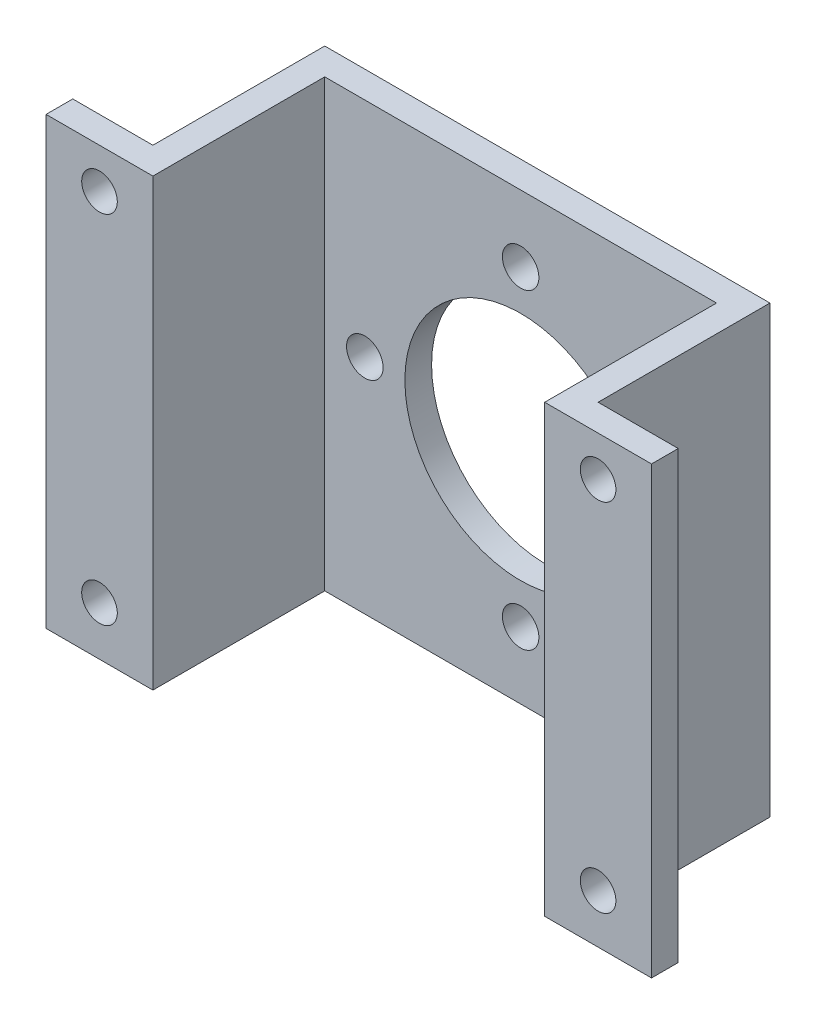
ISO-10303-21;
HEADER;
FILE_DESCRIPTION(('STEP AP214'),'2;1');
FILE_NAME('part.step','',(''),(''),'','','');
FILE_SCHEMA(('AUTOMOTIVE_DESIGN { 1 0 10303 214 1 1 1 1 }'));
ENDSEC;
DATA;
#1=APPLICATION_CONTEXT('core data for automotive mechanical design processes');
#2=APPLICATION_PROTOCOL_DEFINITION('international standard','automotive_design',2000,#1);
#3=PRODUCT_CONTEXT('',#1,'mechanical');
#4=PRODUCT('Part','Part','',(#3));
#5=PRODUCT_RELATED_PRODUCT_CATEGORY('part','',(#4));
#6=PRODUCT_DEFINITION_FORMATION('','',#4);
#7=PRODUCT_DEFINITION_CONTEXT('part definition',#1,'design');
#8=PRODUCT_DEFINITION('design','',#6,#7);
#9=PRODUCT_DEFINITION_SHAPE('','',#8);
#10=(LENGTH_UNIT() NAMED_UNIT(*) SI_UNIT(.MILLI.,.METRE.));
#11=(NAMED_UNIT(*) PLANE_ANGLE_UNIT() SI_UNIT($,.RADIAN.));
#12=(NAMED_UNIT(*) SI_UNIT($,.STERADIAN.) SOLID_ANGLE_UNIT());
#13=UNCERTAINTY_MEASURE_WITH_UNIT(LENGTH_MEASURE(1.E-05),#10,'distance_accuracy_value','');
#14=(GEOMETRIC_REPRESENTATION_CONTEXT(3) GLOBAL_UNCERTAINTY_ASSIGNED_CONTEXT((#13)) GLOBAL_UNIT_ASSIGNED_CONTEXT((#10,
#11,#12)) REPRESENTATION_CONTEXT('',''));
#15=CARTESIAN_POINT('',(0.,0.,0.));
#16=DIRECTION('',(0.,0.,1.));
#17=DIRECTION('',(1.,0.,0.));
#18=AXIS2_PLACEMENT_3D('',#15,#16,#17);
#19=CARTESIAN_POINT('',(-34.,25.,19.3));
#20=DIRECTION('',(0.,0.,-1.));
#21=DIRECTION('',(-1.,0.,0.));
#22=AXIS2_PLACEMENT_3D('',#19,#20,#21);
#23=PLANE('',#22);
#24=CARTESIAN_POINT('',(-28.0000000000001,-19.5,19.3));
#25=DIRECTION('',(0.,0.,-1.));
#26=DIRECTION('',(-1.,0.,0.));
#27=AXIS2_PLACEMENT_3D('',#24,#25,#26);
#28=CIRCLE('',#27,2.00000000000001);
#29=CARTESIAN_POINT('',(-30.0000000000001,-19.5,19.3));
#30=VERTEX_POINT('',#29);
#31=EDGE_CURVE('E302',#30,#30,#28,.T.);
#32=ORIENTED_EDGE('',*,*,#31,.T.);
#33=EDGE_LOOP('',(#32));
#34=FACE_BOUND('',#33,.T.);
#35=CARTESIAN_POINT('',(-28.0000000000001,20.5,19.3));
#36=DIRECTION('',(0.,0.,-1.));
#37=DIRECTION('',(-1.,0.,0.));
#38=AXIS2_PLACEMENT_3D('',#35,#36,#37);
#39=CIRCLE('',#38,2.);
#40=CARTESIAN_POINT('',(-30.0000000000001,20.5,19.3));
#41=VERTEX_POINT('',#40);
#42=EDGE_CURVE('E305',#41,#41,#39,.T.);
#43=ORIENTED_EDGE('',*,*,#42,.T.);
#44=EDGE_LOOP('',(#43));
#45=FACE_BOUND('',#44,.T.);
#46=DIRECTION('',(1.,0.,0.));
#47=VECTOR('',#46,1.);
#48=CARTESIAN_POINT('',(-34.,-25.,19.3));
#49=LINE('',#48,#47);
#50=CARTESIAN_POINT('',(-34.,-25.,19.3));
#51=VERTEX_POINT('',#50);
#52=CARTESIAN_POINT('',(-22.,-25.,19.3));
#53=VERTEX_POINT('',#52);
#54=EDGE_CURVE('E164',#51,#53,#49,.T.);
#55=ORIENTED_EDGE('',*,*,#54,.T.);
#56=DIRECTION('',(0.,-1.,0.));
#57=VECTOR('',#56,1.);
#58=CARTESIAN_POINT('',(-22.,25.,19.3));
#59=LINE('',#58,#57);
#60=CARTESIAN_POINT('',(-22.,25.,19.3));
#61=VERTEX_POINT('',#60);
#62=EDGE_CURVE('E11',#61,#53,#59,.T.);
#63=ORIENTED_EDGE('',*,*,#62,.F.);
#64=DIRECTION('',(1.,0.,0.));
#65=VECTOR('',#64,1.);
#66=CARTESIAN_POINT('',(-34.,25.,19.3));
#67=LINE('',#66,#65);
#68=CARTESIAN_POINT('',(-34.,25.,19.3));
#69=VERTEX_POINT('',#68);
#70=EDGE_CURVE('E199',#69,#61,#67,.T.);
#71=ORIENTED_EDGE('',*,*,#70,.F.);
#72=DIRECTION('',(0.,-1.,0.));
#73=VECTOR('',#72,1.);
#74=CARTESIAN_POINT('',(-34.,25.,19.3));
#75=LINE('',#74,#73);
#76=EDGE_CURVE('E160',#69,#51,#75,.T.);
#77=ORIENTED_EDGE('',*,*,#76,.T.);
#78=EDGE_LOOP('',(#55,#63,#71,#77));
#79=FACE_BOUND('',#78,.T.);
#80=ADVANCED_FACE('F39',(#34,#45,#79),#23,.F.);
#81=CARTESIAN_POINT('',(-22.,25.,19.3));
#82=DIRECTION('',(-1.,0.,0.));
#83=DIRECTION('',(0.,0.,1.));
#84=AXIS2_PLACEMENT_3D('',#81,#82,#83);
#85=PLANE('',#84);
#86=DIRECTION('',(0.,0.,-1.));
#87=VECTOR('',#86,1.);
#88=CARTESIAN_POINT('',(-22.,-25.,19.3));
#89=LINE('',#88,#87);
#90=CARTESIAN_POINT('',(-22.,-25.,0.));
#91=VERTEX_POINT('',#90);
#92=EDGE_CURVE('E168',#53,#91,#89,.T.);
#93=ORIENTED_EDGE('',*,*,#92,.T.);
#94=DIRECTION('',(0.,-1.,0.));
#95=VECTOR('',#94,1.);
#96=CARTESIAN_POINT('',(-22.,25.,0.));
#97=LINE('',#96,#95);
#98=CARTESIAN_POINT('',(-22.,25.,0.));
#99=VERTEX_POINT('',#98);
#100=EDGE_CURVE('E48',#99,#91,#97,.T.);
#101=ORIENTED_EDGE('',*,*,#100,.F.);
#102=DIRECTION('',(0.,0.,-1.));
#103=VECTOR('',#102,1.);
#104=CARTESIAN_POINT('',(-22.,25.,19.3));
#105=LINE('',#104,#103);
#106=EDGE_CURVE('E111',#61,#99,#105,.T.);
#107=ORIENTED_EDGE('',*,*,#106,.F.);
#108=ORIENTED_EDGE('',*,*,#62,.T.);
#109=EDGE_LOOP('',(#93,#101,#107,#108));
#110=FACE_BOUND('',#109,.T.);
#111=ADVANCED_FACE('F294',(#110),#85,.F.);
#112=CARTESIAN_POINT('',(-22.,25.,0.));
#113=DIRECTION('',(0.,0.,-1.));
#114=DIRECTION('',(-1.,0.,0.));
#115=AXIS2_PLACEMENT_3D('',#112,#113,#114);
#116=PLANE('',#115);
#117=CARTESIAN_POINT('',(0.,-17.5,0.));
#118=DIRECTION('',(0.,0.,-1.));
#119=DIRECTION('',(-1.,0.,0.));
#120=AXIS2_PLACEMENT_3D('',#117,#118,#119);
#121=CIRCLE('',#120,2.05);
#122=CARTESIAN_POINT('',(-2.05,-17.5,0.));
#123=VERTEX_POINT('',#122);
#124=EDGE_CURVE('E344',#123,#123,#121,.T.);
#125=ORIENTED_EDGE('',*,*,#124,.T.);
#126=EDGE_LOOP('',(#125));
#127=FACE_BOUND('',#126,.T.);
#128=CARTESIAN_POINT('',(-17.5,0.,0.));
#129=DIRECTION('',(0.,0.,-1.));
#130=DIRECTION('',(-1.,0.,0.));
#131=AXIS2_PLACEMENT_3D('',#128,#129,#130);
#132=CIRCLE('',#131,2.05);
#133=CARTESIAN_POINT('',(-19.55,0.,0.));
#134=VERTEX_POINT('',#133);
#135=EDGE_CURVE('E340',#134,#134,#132,.T.);
#136=ORIENTED_EDGE('',*,*,#135,.T.);
#137=EDGE_LOOP('',(#136));
#138=FACE_BOUND('',#137,.T.);
#139=CARTESIAN_POINT('',(17.5,0.,0.));
#140=DIRECTION('',(0.,0.,-1.));
#141=DIRECTION('',(-1.,0.,0.));
#142=AXIS2_PLACEMENT_3D('',#139,#140,#141);
#143=CIRCLE('',#142,2.05);
#144=CARTESIAN_POINT('',(15.45,0.,0.));
#145=VERTEX_POINT('',#144);
#146=EDGE_CURVE('E336',#145,#145,#143,.T.);
#147=ORIENTED_EDGE('',*,*,#146,.T.);
#148=EDGE_LOOP('',(#147));
#149=FACE_BOUND('',#148,.T.);
#150=CARTESIAN_POINT('',(0.,17.5,0.));
#151=DIRECTION('',(0.,0.,-1.));
#152=DIRECTION('',(-1.,0.,0.));
#153=AXIS2_PLACEMENT_3D('',#150,#151,#152);
#154=CIRCLE('',#153,2.05);
#155=CARTESIAN_POINT('',(-2.05,17.5,0.));
#156=VERTEX_POINT('',#155);
#157=EDGE_CURVE('E329',#156,#156,#154,.T.);
#158=ORIENTED_EDGE('',*,*,#157,.T.);
#159=EDGE_LOOP('',(#158));
#160=FACE_BOUND('',#159,.T.);
#161=CARTESIAN_POINT('',(0.,0.,0.));
#162=DIRECTION('',(0.,0.,-1.));
#163=DIRECTION('',(-1.,0.,0.));
#164=AXIS2_PLACEMENT_3D('',#161,#162,#163);
#165=CIRCLE('',#164,13.);
#166=CARTESIAN_POINT('',(-13.,0.,0.));
#167=VERTEX_POINT('',#166);
#168=EDGE_CURVE('E169',#167,#167,#165,.T.);
#169=ORIENTED_EDGE('',*,*,#168,.T.);
#170=EDGE_LOOP('',(#169));
#171=FACE_BOUND('',#170,.T.);
#172=DIRECTION('',(1.,0.,0.));
#173=VECTOR('',#172,1.);
#174=CARTESIAN_POINT('',(-22.,-25.,0.));
#175=LINE('',#174,#173);
#176=CARTESIAN_POINT('',(22.,-25.,0.));
#177=VERTEX_POINT('',#176);
#178=EDGE_CURVE('E172',#91,#177,#175,.T.);
#179=ORIENTED_EDGE('',*,*,#178,.T.);
#180=DIRECTION('',(0.,-1.,0.));
#181=VECTOR('',#180,1.);
#182=CARTESIAN_POINT('',(22.,25.,0.));
#183=LINE('',#182,#181);
#184=CARTESIAN_POINT('',(22.,25.,0.));
#185=VERTEX_POINT('',#184);
#186=EDGE_CURVE('E226',#185,#177,#183,.T.);
#187=ORIENTED_EDGE('',*,*,#186,.F.);
#188=DIRECTION('',(1.,0.,0.));
#189=VECTOR('',#188,1.);
#190=CARTESIAN_POINT('',(-22.,25.,0.));
#191=LINE('',#190,#189);
#192=EDGE_CURVE('E236',#99,#185,#191,.T.);
#193=ORIENTED_EDGE('',*,*,#192,.F.);
#194=ORIENTED_EDGE('',*,*,#100,.T.);
#195=EDGE_LOOP('',(#179,#187,#193,#194));
#196=FACE_BOUND('',#195,.T.);
#197=ADVANCED_FACE('F234',(#127,#138,#149,#160,#171,#196),#116,.F.);
#198=CARTESIAN_POINT('',(22.,25.,0.));
#199=DIRECTION('',(1.,0.,0.));
#200=DIRECTION('',(0.,0.,-1.));
#201=AXIS2_PLACEMENT_3D('',#198,#199,#200);
#202=PLANE('',#201);
#203=DIRECTION('',(0.,0.,1.));
#204=VECTOR('',#203,1.);
#205=CARTESIAN_POINT('',(22.,-25.,0.));
#206=LINE('',#205,#204);
#207=CARTESIAN_POINT('',(22.,-25.,19.3));
#208=VERTEX_POINT('',#207);
#209=EDGE_CURVE('E175',#177,#208,#206,.T.);
#210=ORIENTED_EDGE('',*,*,#209,.T.);
#211=DIRECTION('',(0.,-1.,0.));
#212=VECTOR('',#211,1.);
#213=CARTESIAN_POINT('',(22.,25.,19.3));
#214=LINE('',#213,#212);
#215=CARTESIAN_POINT('',(22.,25.,19.3));
#216=VERTEX_POINT('',#215);
#217=EDGE_CURVE('E222',#216,#208,#214,.T.);
#218=ORIENTED_EDGE('',*,*,#217,.F.);
#219=DIRECTION('',(0.,0.,1.));
#220=VECTOR('',#219,1.);
#221=CARTESIAN_POINT('',(22.,25.,0.));
#222=LINE('',#221,#220);
#223=EDGE_CURVE('E255',#185,#216,#222,.T.);
#224=ORIENTED_EDGE('',*,*,#223,.F.);
#225=ORIENTED_EDGE('',*,*,#186,.T.);
#226=EDGE_LOOP('',(#210,#218,#224,#225));
#227=FACE_BOUND('',#226,.T.);
#228=ADVANCED_FACE('F245',(#227),#202,.F.);
#229=CARTESIAN_POINT('',(22.,25.,19.3));
#230=DIRECTION('',(0.,0.,-1.));
#231=DIRECTION('',(-1.,0.,0.));
#232=AXIS2_PLACEMENT_3D('',#229,#230,#231);
#233=PLANE('',#232);
#234=CARTESIAN_POINT('',(27.9999999999999,20.5,19.3));
#235=DIRECTION('',(0.,0.,-1.));
#236=DIRECTION('',(-1.,0.,0.));
#237=AXIS2_PLACEMENT_3D('',#234,#235,#236);
#238=CIRCLE('',#237,2.);
#239=CARTESIAN_POINT('',(25.9999999999999,20.5,19.3));
#240=VERTEX_POINT('',#239);
#241=EDGE_CURVE('E317',#240,#240,#238,.T.);
#242=ORIENTED_EDGE('',*,*,#241,.T.);
#243=EDGE_LOOP('',(#242));
#244=FACE_BOUND('',#243,.T.);
#245=CARTESIAN_POINT('',(27.9999999999999,-19.5,19.3));
#246=DIRECTION('',(0.,0.,-1.));
#247=DIRECTION('',(-1.,0.,0.));
#248=AXIS2_PLACEMENT_3D('',#245,#246,#247);
#249=CIRCLE('',#248,2.00000000000001);
#250=CARTESIAN_POINT('',(25.9999999999999,-19.5,19.3));
#251=VERTEX_POINT('',#250);
#252=EDGE_CURVE('E408',#251,#251,#249,.T.);
#253=ORIENTED_EDGE('',*,*,#252,.T.);
#254=EDGE_LOOP('',(#253));
#255=FACE_BOUND('',#254,.T.);
#256=DIRECTION('',(1.,0.,0.));
#257=VECTOR('',#256,1.);
#258=CARTESIAN_POINT('',(22.,-25.,19.3));
#259=LINE('',#258,#257);
#260=CARTESIAN_POINT('',(34.,-25.,19.3));
#261=VERTEX_POINT('',#260);
#262=EDGE_CURVE('E178',#208,#261,#259,.T.);
#263=ORIENTED_EDGE('',*,*,#262,.T.);
#264=DIRECTION('',(0.,-1.,0.));
#265=VECTOR('',#264,1.);
#266=CARTESIAN_POINT('',(34.,25.,19.3));
#267=LINE('',#266,#265);
#268=CARTESIAN_POINT('',(34.,25.,19.3));
#269=VERTEX_POINT('',#268);
#270=EDGE_CURVE('E218',#269,#261,#267,.T.);
#271=ORIENTED_EDGE('',*,*,#270,.F.);
#272=DIRECTION('',(1.,0.,0.));
#273=VECTOR('',#272,1.);
#274=CARTESIAN_POINT('',(22.,25.,19.3));
#275=LINE('',#274,#273);
#276=EDGE_CURVE('E251',#216,#269,#275,.T.);
#277=ORIENTED_EDGE('',*,*,#276,.F.);
#278=ORIENTED_EDGE('',*,*,#217,.T.);
#279=EDGE_LOOP('',(#263,#271,#277,#278));
#280=FACE_BOUND('',#279,.T.);
#281=ADVANCED_FACE('F249',(#244,#255,#280),#233,.F.);
#282=CARTESIAN_POINT('',(34.,25.,16.3));
#283=DIRECTION('',(-1.,0.,0.));
#284=DIRECTION('',(0.,0.,1.));
#285=AXIS2_PLACEMENT_3D('',#282,#283,#284);
#286=PLANE('',#285);
#287=DIRECTION('',(0.,0.,-1.));
#288=VECTOR('',#287,1.);
#289=CARTESIAN_POINT('',(34.,-25.,16.3));
#290=LINE('',#289,#288);
#291=CARTESIAN_POINT('',(34.,-25.,16.3));
#292=VERTEX_POINT('',#291);
#293=EDGE_CURVE('E181',#261,#292,#290,.T.);
#294=ORIENTED_EDGE('',*,*,#293,.T.);
#295=DIRECTION('',(0.,-1.,0.));
#296=VECTOR('',#295,1.);
#297=CARTESIAN_POINT('',(34.,25.,16.3));
#298=LINE('',#297,#296);
#299=CARTESIAN_POINT('',(34.,25.,16.3));
#300=VERTEX_POINT('',#299);
#301=EDGE_CURVE('E214',#300,#292,#298,.T.);
#302=ORIENTED_EDGE('',*,*,#301,.F.);
#303=DIRECTION('',(0.,0.,-1.));
#304=VECTOR('',#303,1.);
#305=CARTESIAN_POINT('',(34.,25.,16.3));
#306=LINE('',#305,#304);
#307=EDGE_CURVE('E254',#269,#300,#306,.T.);
#308=ORIENTED_EDGE('',*,*,#307,.F.);
#309=ORIENTED_EDGE('',*,*,#270,.T.);
#310=EDGE_LOOP('',(#294,#302,#308,#309));
#311=FACE_BOUND('',#310,.T.);
#312=ADVANCED_FACE('F426',(#311),#286,.F.);
#313=CARTESIAN_POINT('',(25.,25.,16.3));
#314=DIRECTION('',(0.,0.,1.));
#315=DIRECTION('',(1.,0.,0.));
#316=AXIS2_PLACEMENT_3D('',#313,#314,#315);
#317=PLANE('',#316);
#318=CARTESIAN_POINT('',(27.9999999999999,20.5,16.3));
#319=DIRECTION('',(0.,0.,-1.));
#320=DIRECTION('',(-1.,0.,0.));
#321=AXIS2_PLACEMENT_3D('',#318,#319,#320);
#322=CIRCLE('',#321,2.);
#323=CARTESIAN_POINT('',(25.9999999999999,20.5,16.3));
#324=VERTEX_POINT('',#323);
#325=EDGE_CURVE('E414',#324,#324,#322,.T.);
#326=ORIENTED_EDGE('',*,*,#325,.F.);
#327=EDGE_LOOP('',(#326));
#328=FACE_BOUND('',#327,.T.);
#329=CARTESIAN_POINT('',(27.9999999999999,-19.5,16.3));
#330=DIRECTION('',(0.,0.,-1.));
#331=DIRECTION('',(-1.,0.,0.));
#332=AXIS2_PLACEMENT_3D('',#329,#330,#331);
#333=CIRCLE('',#332,2.00000000000001);
#334=CARTESIAN_POINT('',(25.9999999999999,-19.5,16.3));
#335=VERTEX_POINT('',#334);
#336=EDGE_CURVE('E417',#335,#335,#333,.T.);
#337=ORIENTED_EDGE('',*,*,#336,.F.);
#338=EDGE_LOOP('',(#337));
#339=FACE_BOUND('',#338,.T.);
#340=DIRECTION('',(-1.,0.,0.));
#341=VECTOR('',#340,1.);
#342=CARTESIAN_POINT('',(25.,-25.,16.3));
#343=LINE('',#342,#341);
#344=CARTESIAN_POINT('',(25.,-25.,16.3));
#345=VERTEX_POINT('',#344);
#346=EDGE_CURVE('E184',#292,#345,#343,.T.);
#347=ORIENTED_EDGE('',*,*,#346,.T.);
#348=DIRECTION('',(0.,-1.,0.));
#349=VECTOR('',#348,1.);
#350=CARTESIAN_POINT('',(25.,25.,16.3));
#351=LINE('',#350,#349);
#352=CARTESIAN_POINT('',(25.,25.,16.3));
#353=VERTEX_POINT('',#352);
#354=EDGE_CURVE('E210',#353,#345,#351,.T.);
#355=ORIENTED_EDGE('',*,*,#354,.F.);
#356=DIRECTION('',(-1.,0.,0.));
#357=VECTOR('',#356,1.);
#358=CARTESIAN_POINT('',(25.,25.,16.3));
#359=LINE('',#358,#357);
#360=EDGE_CURVE('E259',#300,#353,#359,.T.);
#361=ORIENTED_EDGE('',*,*,#360,.F.);
#362=ORIENTED_EDGE('',*,*,#301,.T.);
#363=EDGE_LOOP('',(#347,#355,#361,#362));
#364=FACE_BOUND('',#363,.T.);
#365=ADVANCED_FACE('F434',(#328,#339,#364),#317,.F.);
#366=CARTESIAN_POINT('',(25.,25.,-3.));
#367=DIRECTION('',(-1.,0.,0.));
#368=DIRECTION('',(0.,0.,1.));
#369=AXIS2_PLACEMENT_3D('',#366,#367,#368);
#370=PLANE('',#369);
#371=DIRECTION('',(0.,0.,-1.));
#372=VECTOR('',#371,1.);
#373=CARTESIAN_POINT('',(25.,-25.,-3.));
#374=LINE('',#373,#372);
#375=CARTESIAN_POINT('',(25.,-25.,-3.));
#376=VERTEX_POINT('',#375);
#377=EDGE_CURVE('E187',#345,#376,#374,.T.);
#378=ORIENTED_EDGE('',*,*,#377,.T.);
#379=DIRECTION('',(0.,-1.,0.));
#380=VECTOR('',#379,1.);
#381=CARTESIAN_POINT('',(25.,25.,-3.));
#382=LINE('',#381,#380);
#383=CARTESIAN_POINT('',(25.,25.,-3.));
#384=VERTEX_POINT('',#383);
#385=EDGE_CURVE('E206',#384,#376,#382,.T.);
#386=ORIENTED_EDGE('',*,*,#385,.F.);
#387=DIRECTION('',(0.,0.,-1.));
#388=VECTOR('',#387,1.);
#389=CARTESIAN_POINT('',(25.,25.,-3.));
#390=LINE('',#389,#388);
#391=EDGE_CURVE('E266',#353,#384,#390,.T.);
#392=ORIENTED_EDGE('',*,*,#391,.F.);
#393=ORIENTED_EDGE('',*,*,#354,.T.);
#394=EDGE_LOOP('',(#378,#386,#392,#393));
#395=FACE_BOUND('',#394,.T.);
#396=ADVANCED_FACE('F274',(#395),#370,.F.);
#397=CARTESIAN_POINT('',(-25.,25.,-3.));
#398=DIRECTION('',(0.,0.,1.));
#399=DIRECTION('',(1.,0.,0.));
#400=AXIS2_PLACEMENT_3D('',#397,#398,#399);
#401=PLANE('',#400);
#402=CARTESIAN_POINT('',(0.,-17.5,-3.));
#403=DIRECTION('',(0.,0.,-1.));
#404=DIRECTION('',(-1.,0.,0.));
#405=AXIS2_PLACEMENT_3D('',#402,#403,#404);
#406=CIRCLE('',#405,2.05);
#407=CARTESIAN_POINT('',(-2.05,-17.5,-3.));
#408=VERTEX_POINT('',#407);
#409=EDGE_CURVE('E308',#408,#408,#406,.T.);
#410=ORIENTED_EDGE('',*,*,#409,.F.);
#411=EDGE_LOOP('',(#410));
#412=FACE_BOUND('',#411,.T.);
#413=CARTESIAN_POINT('',(-17.5,0.,-3.));
#414=DIRECTION('',(0.,0.,-1.));
#415=DIRECTION('',(-1.,0.,0.));
#416=AXIS2_PLACEMENT_3D('',#413,#414,#415);
#417=CIRCLE('',#416,2.05);
#418=CARTESIAN_POINT('',(-19.55,0.,-3.));
#419=VERTEX_POINT('',#418);
#420=EDGE_CURVE('E314',#419,#419,#417,.T.);
#421=ORIENTED_EDGE('',*,*,#420,.F.);
#422=EDGE_LOOP('',(#421));
#423=FACE_BOUND('',#422,.T.);
#424=CARTESIAN_POINT('',(17.5,0.,-3.));
#425=DIRECTION('',(0.,0.,-1.));
#426=DIRECTION('',(-1.,0.,0.));
#427=AXIS2_PLACEMENT_3D('',#424,#425,#426);
#428=CIRCLE('',#427,2.05);
#429=CARTESIAN_POINT('',(15.45,0.,-3.));
#430=VERTEX_POINT('',#429);
#431=EDGE_CURVE('E323',#430,#430,#428,.T.);
#432=ORIENTED_EDGE('',*,*,#431,.F.);
#433=EDGE_LOOP('',(#432));
#434=FACE_BOUND('',#433,.T.);
#435=CARTESIAN_POINT('',(0.,17.5,-3.));
#436=DIRECTION('',(0.,0.,-1.));
#437=DIRECTION('',(-1.,0.,0.));
#438=AXIS2_PLACEMENT_3D('',#435,#436,#437);
#439=CIRCLE('',#438,2.05);
#440=CARTESIAN_POINT('',(-2.05,17.5,-3.));
#441=VERTEX_POINT('',#440);
#442=EDGE_CURVE('E325',#441,#441,#439,.T.);
#443=ORIENTED_EDGE('',*,*,#442,.F.);
#444=EDGE_LOOP('',(#443));
#445=FACE_BOUND('',#444,.T.);
#446=CARTESIAN_POINT('',(0.,0.,-3.));
#447=DIRECTION('',(0.,0.,-1.));
#448=DIRECTION('',(-1.,0.,0.));
#449=AXIS2_PLACEMENT_3D('',#446,#447,#448);
#450=CIRCLE('',#449,13.);
#451=CARTESIAN_POINT('',(-13.,0.,-3.));
#452=VERTEX_POINT('',#451);
#453=EDGE_CURVE('E348',#452,#452,#450,.T.);
#454=ORIENTED_EDGE('',*,*,#453,.F.);
#455=EDGE_LOOP('',(#454));
#456=FACE_BOUND('',#455,.T.);
#457=DIRECTION('',(-1.,0.,0.));
#458=VECTOR('',#457,1.);
#459=CARTESIAN_POINT('',(-25.,-25.,-3.));
#460=LINE('',#459,#458);
#461=CARTESIAN_POINT('',(-25.,-25.,-3.));
#462=VERTEX_POINT('',#461);
#463=EDGE_CURVE('E190',#376,#462,#460,.T.);
#464=ORIENTED_EDGE('',*,*,#463,.T.);
#465=DIRECTION('',(0.,-1.,0.));
#466=VECTOR('',#465,1.);
#467=CARTESIAN_POINT('',(-25.,25.,-3.));
#468=LINE('',#467,#466);
#469=CARTESIAN_POINT('',(-25.,25.,-3.));
#470=VERTEX_POINT('',#469);
#471=EDGE_CURVE('E153',#470,#462,#468,.T.);
#472=ORIENTED_EDGE('',*,*,#471,.F.);
#473=DIRECTION('',(-1.,0.,0.));
#474=VECTOR('',#473,1.);
#475=CARTESIAN_POINT('',(-25.,25.,-3.));
#476=LINE('',#475,#474);
#477=EDGE_CURVE('E142',#384,#470,#476,.T.);
#478=ORIENTED_EDGE('',*,*,#477,.F.);
#479=ORIENTED_EDGE('',*,*,#385,.T.);
#480=EDGE_LOOP('',(#464,#472,#478,#479));
#481=FACE_BOUND('',#480,.T.);
#482=ADVANCED_FACE('F278',(#412,#423,#434,#445,#456,#481),#401,.F.);
#483=CARTESIAN_POINT('',(-25.,25.,16.3));
#484=DIRECTION('',(1.,0.,0.));
#485=DIRECTION('',(0.,0.,-1.));
#486=AXIS2_PLACEMENT_3D('',#483,#484,#485);
#487=PLANE('',#486);
#488=DIRECTION('',(0.,0.,1.));
#489=VECTOR('',#488,1.);
#490=CARTESIAN_POINT('',(-25.,-25.,16.3));
#491=LINE('',#490,#489);
#492=CARTESIAN_POINT('',(-25.,-25.,16.3));
#493=VERTEX_POINT('',#492);
#494=EDGE_CURVE('E151',#462,#493,#491,.T.);
#495=ORIENTED_EDGE('',*,*,#494,.T.);
#496=DIRECTION('',(0.,-1.,0.));
#497=VECTOR('',#496,1.);
#498=CARTESIAN_POINT('',(-25.,25.,16.3));
#499=LINE('',#498,#497);
#500=CARTESIAN_POINT('',(-25.,25.,16.3));
#501=VERTEX_POINT('',#500);
#502=EDGE_CURVE('E148',#501,#493,#499,.T.);
#503=ORIENTED_EDGE('',*,*,#502,.F.);
#504=DIRECTION('',(0.,0.,1.));
#505=VECTOR('',#504,1.);
#506=CARTESIAN_POINT('',(-25.,25.,16.3));
#507=LINE('',#506,#505);
#508=EDGE_CURVE('E136',#470,#501,#507,.T.);
#509=ORIENTED_EDGE('',*,*,#508,.F.);
#510=ORIENTED_EDGE('',*,*,#471,.T.);
#511=EDGE_LOOP('',(#495,#503,#509,#510));
#512=FACE_BOUND('',#511,.T.);
#513=ADVANCED_FACE('F149',(#512),#487,.F.);
#514=CARTESIAN_POINT('',(-34.,25.,16.3));
#515=DIRECTION('',(0.,0.,1.));
#516=DIRECTION('',(1.,0.,0.));
#517=AXIS2_PLACEMENT_3D('',#514,#515,#516);
#518=PLANE('',#517);
#519=CARTESIAN_POINT('',(-28.0000000000001,-19.5,16.3));
#520=DIRECTION('',(0.,0.,-1.));
#521=DIRECTION('',(-1.,0.,0.));
#522=AXIS2_PLACEMENT_3D('',#519,#520,#521);
#523=CIRCLE('',#522,2.00000000000001);
#524=CARTESIAN_POINT('',(-30.0000000000001,-19.5,16.3));
#525=VERTEX_POINT('',#524);
#526=EDGE_CURVE('E406',#525,#525,#523,.T.);
#527=ORIENTED_EDGE('',*,*,#526,.F.);
#528=EDGE_LOOP('',(#527));
#529=FACE_BOUND('',#528,.T.);
#530=CARTESIAN_POINT('',(-28.0000000000001,20.5,16.3));
#531=DIRECTION('',(0.,0.,-1.));
#532=DIRECTION('',(-1.,0.,0.));
#533=AXIS2_PLACEMENT_3D('',#530,#531,#532);
#534=CIRCLE('',#533,2.);
#535=CARTESIAN_POINT('',(-30.0000000000001,20.5,16.3));
#536=VERTEX_POINT('',#535);
#537=EDGE_CURVE('E309',#536,#536,#534,.T.);
#538=ORIENTED_EDGE('',*,*,#537,.F.);
#539=EDGE_LOOP('',(#538));
#540=FACE_BOUND('',#539,.T.);
#541=DIRECTION('',(-1.,0.,0.));
#542=VECTOR('',#541,1.);
#543=CARTESIAN_POINT('',(-34.,-25.,16.3));
#544=LINE('',#543,#542);
#545=CARTESIAN_POINT('',(-34.,-25.,16.3));
#546=VERTEX_POINT('',#545);
#547=EDGE_CURVE('E97',#493,#546,#544,.T.);
#548=ORIENTED_EDGE('',*,*,#547,.T.);
#549=DIRECTION('',(0.,-1.,0.));
#550=VECTOR('',#549,1.);
#551=CARTESIAN_POINT('',(-34.,25.,16.3));
#552=LINE('',#551,#550);
#553=CARTESIAN_POINT('',(-34.,25.,16.3));
#554=VERTEX_POINT('',#553);
#555=EDGE_CURVE('E154',#554,#546,#552,.T.);
#556=ORIENTED_EDGE('',*,*,#555,.F.);
#557=DIRECTION('',(-1.,0.,0.));
#558=VECTOR('',#557,1.);
#559=CARTESIAN_POINT('',(-34.,25.,16.3));
#560=LINE('',#559,#558);
#561=EDGE_CURVE('E140',#501,#554,#560,.T.);
#562=ORIENTED_EDGE('',*,*,#561,.F.);
#563=ORIENTED_EDGE('',*,*,#502,.T.);
#564=EDGE_LOOP('',(#548,#556,#562,#563));
#565=FACE_BOUND('',#564,.T.);
#566=ADVANCED_FACE('F156',(#529,#540,#565),#518,.F.);
#567=CARTESIAN_POINT('',(-34.,25.,16.3));
#568=DIRECTION('',(1.,0.,0.));
#569=DIRECTION('',(0.,0.,-1.));
#570=AXIS2_PLACEMENT_3D('',#567,#568,#569);
#571=PLANE('',#570);
#572=DIRECTION('',(0.,0.,1.));
#573=VECTOR('',#572,1.);
#574=CARTESIAN_POINT('',(-34.,-25.,16.3));
#575=LINE('',#574,#573);
#576=EDGE_CURVE('E103',#546,#51,#575,.T.);
#577=ORIENTED_EDGE('',*,*,#576,.T.);
#578=ORIENTED_EDGE('',*,*,#76,.F.);
#579=DIRECTION('',(0.,0.,1.));
#580=VECTOR('',#579,1.);
#581=CARTESIAN_POINT('',(-34.,25.,16.3));
#582=LINE('',#581,#580);
#583=EDGE_CURVE('E56',#554,#69,#582,.T.);
#584=ORIENTED_EDGE('',*,*,#583,.F.);
#585=ORIENTED_EDGE('',*,*,#555,.T.);
#586=EDGE_LOOP('',(#577,#578,#584,#585));
#587=FACE_BOUND('',#586,.T.);
#588=ADVANCED_FACE('F282',(#587),#571,.F.);
#589=CARTESIAN_POINT('',(0.,25.,0.));
#590=DIRECTION('',(0.,1.,0.));
#591=DIRECTION('',(0.,0.,1.));
#592=AXIS2_PLACEMENT_3D('',#589,#590,#591);
#593=PLANE('',#592);
#594=ORIENTED_EDGE('',*,*,#70,.T.);
#595=ORIENTED_EDGE('',*,*,#106,.T.);
#596=ORIENTED_EDGE('',*,*,#192,.T.);
#597=ORIENTED_EDGE('',*,*,#223,.T.);
#598=ORIENTED_EDGE('',*,*,#276,.T.);
#599=ORIENTED_EDGE('',*,*,#307,.T.);
#600=ORIENTED_EDGE('',*,*,#360,.T.);
#601=ORIENTED_EDGE('',*,*,#391,.T.);
#602=ORIENTED_EDGE('',*,*,#477,.T.);
#603=ORIENTED_EDGE('',*,*,#508,.T.);
#604=ORIENTED_EDGE('',*,*,#561,.T.);
#605=ORIENTED_EDGE('',*,*,#583,.T.);
#606=EDGE_LOOP('',(#594,#595,#596,#597,#598,#599,#600,#601,#602,#603,#604,#605));
#607=FACE_BOUND('',#606,.T.);
#608=ADVANCED_FACE('F138',(#607),#593,.T.);
#609=CARTESIAN_POINT('',(0.,-25.,0.));
#610=DIRECTION('',(0.,1.,0.));
#611=DIRECTION('',(0.,0.,1.));
#612=AXIS2_PLACEMENT_3D('',#609,#610,#611);
#613=PLANE('',#612);
#614=ORIENTED_EDGE('',*,*,#54,.F.);
#615=ORIENTED_EDGE('',*,*,#576,.F.);
#616=ORIENTED_EDGE('',*,*,#547,.F.);
#617=ORIENTED_EDGE('',*,*,#494,.F.);
#618=ORIENTED_EDGE('',*,*,#463,.F.);
#619=ORIENTED_EDGE('',*,*,#377,.F.);
#620=ORIENTED_EDGE('',*,*,#346,.F.);
#621=ORIENTED_EDGE('',*,*,#293,.F.);
#622=ORIENTED_EDGE('',*,*,#262,.F.);
#623=ORIENTED_EDGE('',*,*,#209,.F.);
#624=ORIENTED_EDGE('',*,*,#178,.F.);
#625=ORIENTED_EDGE('',*,*,#92,.F.);
#626=EDGE_LOOP('',(#614,#615,#616,#617,#618,#619,#620,#621,#622,#623,#624,#625));
#627=FACE_BOUND('',#626,.T.);
#628=ADVANCED_FACE('F240',(#627),#613,.F.);
#629=CARTESIAN_POINT('',(0.,0.,47.));
#630=DIRECTION('',(0.,0.,-1.));
#631=DIRECTION('',(-1.,0.,0.));
#632=AXIS2_PLACEMENT_3D('',#629,#630,#631);
#633=CYLINDRICAL_SURFACE('',#632,13.);
#634=ORIENTED_EDGE('',*,*,#453,.T.);
#635=EDGE_LOOP('',(#634));
#636=FACE_BOUND('',#635,.T.);
#637=ORIENTED_EDGE('',*,*,#168,.F.);
#638=EDGE_LOOP('',(#637));
#639=FACE_BOUND('',#638,.T.);
#640=ADVANCED_FACE('F362',(#636,#639),#633,.F.);
#641=CARTESIAN_POINT('',(0.,17.5,47.));
#642=DIRECTION('',(0.,0.,-1.));
#643=DIRECTION('',(-1.,0.,0.));
#644=AXIS2_PLACEMENT_3D('',#641,#642,#643);
#645=CYLINDRICAL_SURFACE('',#644,2.05);
#646=ORIENTED_EDGE('',*,*,#442,.T.);
#647=EDGE_LOOP('',(#646));
#648=FACE_BOUND('',#647,.T.);
#649=ORIENTED_EDGE('',*,*,#157,.F.);
#650=EDGE_LOOP('',(#649));
#651=FACE_BOUND('',#650,.T.);
#652=ADVANCED_FACE('F364',(#648,#651),#645,.F.);
#653=CARTESIAN_POINT('',(17.5,0.,47.));
#654=DIRECTION('',(0.,0.,-1.));
#655=DIRECTION('',(-1.,0.,0.));
#656=AXIS2_PLACEMENT_3D('',#653,#654,#655);
#657=CYLINDRICAL_SURFACE('',#656,2.05);
#658=ORIENTED_EDGE('',*,*,#431,.T.);
#659=EDGE_LOOP('',(#658));
#660=FACE_BOUND('',#659,.T.);
#661=ORIENTED_EDGE('',*,*,#146,.F.);
#662=EDGE_LOOP('',(#661));
#663=FACE_BOUND('',#662,.T.);
#664=ADVANCED_FACE('F371',(#660,#663),#657,.F.);
#665=CARTESIAN_POINT('',(-17.5,0.,47.));
#666=DIRECTION('',(0.,0.,-1.));
#667=DIRECTION('',(-1.,0.,0.));
#668=AXIS2_PLACEMENT_3D('',#665,#666,#667);
#669=CYLINDRICAL_SURFACE('',#668,2.05);
#670=ORIENTED_EDGE('',*,*,#420,.T.);
#671=EDGE_LOOP('',(#670));
#672=FACE_BOUND('',#671,.T.);
#673=ORIENTED_EDGE('',*,*,#135,.F.);
#674=EDGE_LOOP('',(#673));
#675=FACE_BOUND('',#674,.T.);
#676=ADVANCED_FACE('F376',(#672,#675),#669,.F.);
#677=CARTESIAN_POINT('',(0.,-17.5,47.));
#678=DIRECTION('',(0.,0.,-1.));
#679=DIRECTION('',(-1.,0.,0.));
#680=AXIS2_PLACEMENT_3D('',#677,#678,#679);
#681=CYLINDRICAL_SURFACE('',#680,2.05);
#682=ORIENTED_EDGE('',*,*,#409,.T.);
#683=EDGE_LOOP('',(#682));
#684=FACE_BOUND('',#683,.T.);
#685=ORIENTED_EDGE('',*,*,#124,.F.);
#686=EDGE_LOOP('',(#685));
#687=FACE_BOUND('',#686,.T.);
#688=ADVANCED_FACE('F379',(#684,#687),#681,.F.);
#689=CARTESIAN_POINT('',(-28.0000000000001,20.5,26.3));
#690=DIRECTION('',(0.,0.,-1.));
#691=DIRECTION('',(-1.,0.,0.));
#692=AXIS2_PLACEMENT_3D('',#689,#690,#691);
#693=CYLINDRICAL_SURFACE('',#692,2.);
#694=ORIENTED_EDGE('',*,*,#537,.T.);
#695=EDGE_LOOP('',(#694));
#696=FACE_BOUND('',#695,.T.);
#697=ORIENTED_EDGE('',*,*,#42,.F.);
#698=EDGE_LOOP('',(#697));
#699=FACE_BOUND('',#698,.T.);
#700=ADVANCED_FACE('F382',(#696,#699),#693,.F.);
#701=CARTESIAN_POINT('',(-28.0000000000001,-19.5,26.3));
#702=DIRECTION('',(0.,0.,-1.));
#703=DIRECTION('',(-1.,0.,0.));
#704=AXIS2_PLACEMENT_3D('',#701,#702,#703);
#705=CYLINDRICAL_SURFACE('',#704,2.00000000000001);
#706=ORIENTED_EDGE('',*,*,#526,.T.);
#707=EDGE_LOOP('',(#706));
#708=FACE_BOUND('',#707,.T.);
#709=ORIENTED_EDGE('',*,*,#31,.F.);
#710=EDGE_LOOP('',(#709));
#711=FACE_BOUND('',#710,.T.);
#712=ADVANCED_FACE('F389',(#708,#711),#705,.F.);
#713=CARTESIAN_POINT('',(27.9999999999999,-19.5,26.3));
#714=DIRECTION('',(0.,0.,-1.));
#715=DIRECTION('',(-1.,0.,0.));
#716=AXIS2_PLACEMENT_3D('',#713,#714,#715);
#717=CYLINDRICAL_SURFACE('',#716,2.00000000000001);
#718=ORIENTED_EDGE('',*,*,#336,.T.);
#719=EDGE_LOOP('',(#718));
#720=FACE_BOUND('',#719,.T.);
#721=ORIENTED_EDGE('',*,*,#252,.F.);
#722=EDGE_LOOP('',(#721));
#723=FACE_BOUND('',#722,.T.);
#724=ADVANCED_FACE('F391',(#720,#723),#717,.F.);
#725=CARTESIAN_POINT('',(27.9999999999999,20.5,26.3));
#726=DIRECTION('',(0.,0.,-1.));
#727=DIRECTION('',(-1.,0.,0.));
#728=AXIS2_PLACEMENT_3D('',#725,#726,#727);
#729=CYLINDRICAL_SURFACE('',#728,2.);
#730=ORIENTED_EDGE('',*,*,#325,.T.);
#731=EDGE_LOOP('',(#730));
#732=FACE_BOUND('',#731,.T.);
#733=ORIENTED_EDGE('',*,*,#241,.F.);
#734=EDGE_LOOP('',(#733));
#735=FACE_BOUND('',#734,.T.);
#736=ADVANCED_FACE('F394',(#732,#735),#729,.F.);
#737=CLOSED_SHELL('',(#80,#111,#197,#228,#281,#312,#365,#396,#482,#513,#566,#588,#608,#628,#640,
#652,#664,#676,#688,#700,#712,#724,#736));
#738=MANIFOLD_SOLID_BREP('B2',#737);
#739=ADVANCED_BREP_SHAPE_REPRESENTATION('',(#18,#738),#14);
#740=SHAPE_DEFINITION_REPRESENTATION(#9,#739);
ENDSEC;
END-ISO-10303-21;
